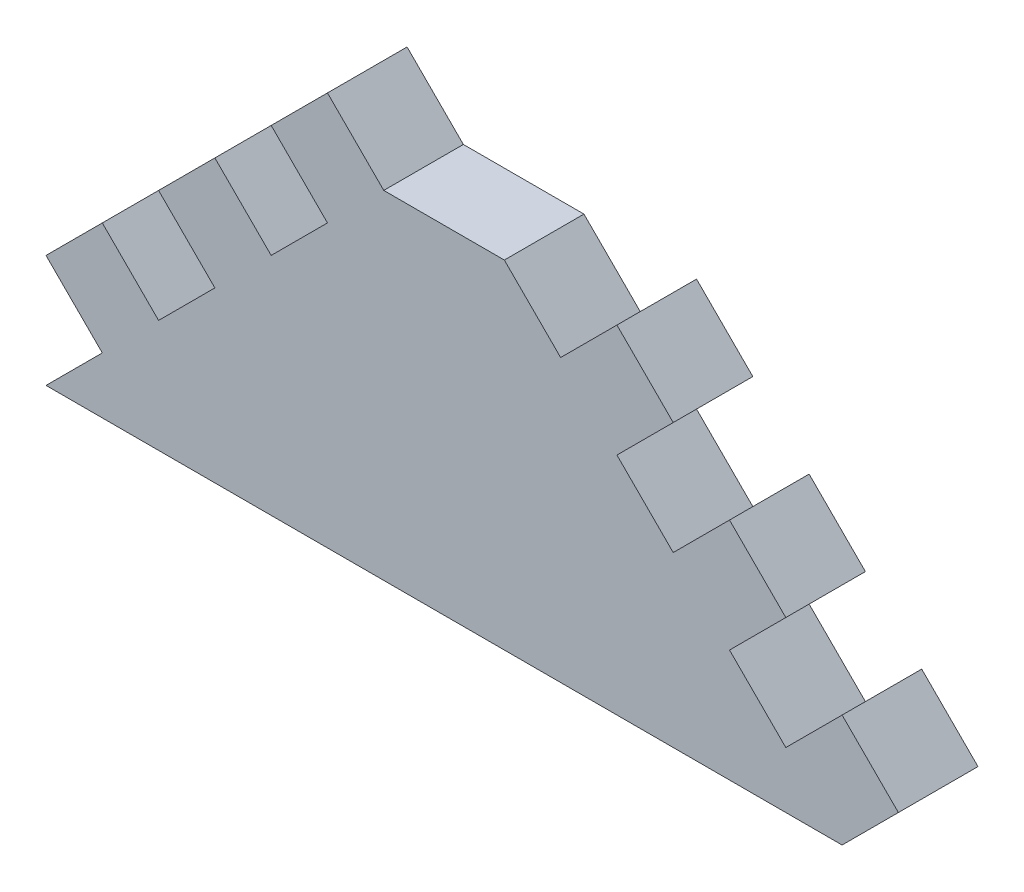
ISO-10303-21;
HEADER;
FILE_DESCRIPTION(('STEP AP214'),'2;1');
FILE_NAME('part.step','',(''),(''),'','','');
FILE_SCHEMA(('AUTOMOTIVE_DESIGN { 1 0 10303 214 1 1 1 1 }'));
ENDSEC;
DATA;
#1=APPLICATION_CONTEXT('core data for automotive mechanical design processes');
#2=APPLICATION_PROTOCOL_DEFINITION('international standard','automotive_design',2000,#1);
#3=PRODUCT_CONTEXT('',#1,'mechanical');
#4=PRODUCT('Part','Part','',(#3));
#5=PRODUCT_RELATED_PRODUCT_CATEGORY('part','',(#4));
#6=PRODUCT_DEFINITION_FORMATION('','',#4);
#7=PRODUCT_DEFINITION_CONTEXT('part definition',#1,'design');
#8=PRODUCT_DEFINITION('design','',#6,#7);
#9=PRODUCT_DEFINITION_SHAPE('','',#8);
#10=(LENGTH_UNIT() NAMED_UNIT(*) SI_UNIT(.MILLI.,.METRE.));
#11=(NAMED_UNIT(*) PLANE_ANGLE_UNIT() SI_UNIT($,.RADIAN.));
#12=(NAMED_UNIT(*) SI_UNIT($,.STERADIAN.) SOLID_ANGLE_UNIT());
#13=UNCERTAINTY_MEASURE_WITH_UNIT(LENGTH_MEASURE(1.E-05),#10,'distance_accuracy_value','');
#14=(GEOMETRIC_REPRESENTATION_CONTEXT(3) GLOBAL_UNCERTAINTY_ASSIGNED_CONTEXT((#13)) GLOBAL_UNIT_ASSIGNED_CONTEXT((#10,
#11,#12)) REPRESENTATION_CONTEXT('',''));
#15=CARTESIAN_POINT('',(0.,0.,0.));
#16=DIRECTION('',(0.,0.,1.));
#17=DIRECTION('',(1.,0.,0.));
#18=AXIS2_PLACEMENT_3D('',#15,#16,#17);
#19=CARTESIAN_POINT('',(0.,0.,5.));
#20=DIRECTION('',(0.707106781186545,-0.70710678118655,0.));
#21=DIRECTION('',(0.70710678118655,0.707106781186545,0.));
#22=AXIS2_PLACEMENT_3D('',#19,#20,#21);
#23=PLANE('',#22);
#24=DIRECTION('',(-0.70710678118655,-0.707106781186545,0.));
#25=VECTOR('',#24,1.);
#26=CARTESIAN_POINT('',(0.,0.,0.));
#27=LINE('',#26,#25);
#28=CARTESIAN_POINT('',(3.53553390593276,3.53553390593273,0.));
#29=VERTEX_POINT('',#28);
#30=CARTESIAN_POINT('',(0.,0.,0.));
#31=VERTEX_POINT('',#30);
#32=EDGE_CURVE('E241',#29,#31,#27,.T.);
#33=ORIENTED_EDGE('',*,*,#32,.T.);
#34=DIRECTION('',(0.,0.,-1.));
#35=VECTOR('',#34,1.);
#36=CARTESIAN_POINT('',(0.,0.,5.));
#37=LINE('',#36,#35);
#38=CARTESIAN_POINT('',(0.,0.,5.));
#39=VERTEX_POINT('',#38);
#40=EDGE_CURVE('E11',#39,#31,#37,.T.);
#41=ORIENTED_EDGE('',*,*,#40,.F.);
#42=DIRECTION('',(-0.70710678118655,-0.707106781186545,0.));
#43=VECTOR('',#42,1.);
#44=CARTESIAN_POINT('',(0.,0.,5.));
#45=LINE('',#44,#43);
#46=CARTESIAN_POINT('',(3.53553390593276,3.53553390593273,5.));
#47=VERTEX_POINT('',#46);
#48=EDGE_CURVE('E291',#47,#39,#45,.T.);
#49=ORIENTED_EDGE('',*,*,#48,.F.);
#50=DIRECTION('',(0.,0.,-1.));
#51=VECTOR('',#50,1.);
#52=CARTESIAN_POINT('',(3.53553390593276,3.53553390593273,5.));
#53=LINE('',#52,#51);
#54=EDGE_CURVE('E237',#47,#29,#53,.T.);
#55=ORIENTED_EDGE('',*,*,#54,.T.);
#56=EDGE_LOOP('',(#33,#41,#49,#55));
#57=FACE_BOUND('',#56,.T.);
#58=ADVANCED_FACE('F37',(#57),#23,.F.);
#59=CARTESIAN_POINT('',(0.,0.,5.));
#60=DIRECTION('',(0.,1.,0.));
#61=DIRECTION('',(0.,0.,1.));
#62=AXIS2_PLACEMENT_3D('',#59,#60,#61);
#63=PLANE('',#62);
#64=DIRECTION('',(1.,0.,0.));
#65=VECTOR('',#64,1.);
#66=CARTESIAN_POINT('',(0.,0.,0.));
#67=LINE('',#66,#65);
#68=CARTESIAN_POINT('',(50.,0.,0.));
#69=VERTEX_POINT('',#68);
#70=EDGE_CURVE('E244',#31,#69,#67,.T.);
#71=ORIENTED_EDGE('',*,*,#70,.T.);
#72=DIRECTION('',(0.,0.,-1.));
#73=VECTOR('',#72,1.);
#74=CARTESIAN_POINT('',(50.,0.,5.));
#75=LINE('',#74,#73);
#76=CARTESIAN_POINT('',(50.,0.,5.));
#77=VERTEX_POINT('',#76);
#78=EDGE_CURVE('E45',#77,#69,#75,.T.);
#79=ORIENTED_EDGE('',*,*,#78,.F.);
#80=DIRECTION('',(1.,0.,0.));
#81=VECTOR('',#80,1.);
#82=CARTESIAN_POINT('',(0.,0.,5.));
#83=LINE('',#82,#81);
#84=EDGE_CURVE('E150',#39,#77,#83,.T.);
#85=ORIENTED_EDGE('',*,*,#84,.F.);
#86=ORIENTED_EDGE('',*,*,#40,.T.);
#87=EDGE_LOOP('',(#71,#79,#85,#86));
#88=FACE_BOUND('',#87,.T.);
#89=ADVANCED_FACE('F439',(#88),#63,.F.);
#90=CARTESIAN_POINT('',(53.5355339059327,3.53553390593274,5.));
#91=DIRECTION('',(-0.707106781186547,0.707106781186548,0.));
#92=DIRECTION('',(-0.707106781186548,-0.707106781186547,0.));
#93=AXIS2_PLACEMENT_3D('',#90,#91,#92);
#94=PLANE('',#93);
#95=DIRECTION('',(0.707106781186548,0.707106781186547,0.));
#96=VECTOR('',#95,1.);
#97=CARTESIAN_POINT('',(53.5355339059327,3.53553390593274,0.));
#98=LINE('',#97,#96);
#99=CARTESIAN_POINT('',(53.5355339059327,3.53553390593274,0.));
#100=VERTEX_POINT('',#99);
#101=EDGE_CURVE('E246',#69,#100,#98,.T.);
#102=ORIENTED_EDGE('',*,*,#101,.T.);
#103=DIRECTION('',(0.,0.,-1.));
#104=VECTOR('',#103,1.);
#105=CARTESIAN_POINT('',(53.5355339059327,3.53553390593274,5.));
#106=LINE('',#105,#104);
#107=CARTESIAN_POINT('',(53.5355339059327,3.53553390593274,5.));
#108=VERTEX_POINT('',#107);
#109=EDGE_CURVE('E352',#108,#100,#106,.T.);
#110=ORIENTED_EDGE('',*,*,#109,.F.);
#111=DIRECTION('',(0.707106781186548,0.707106781186547,0.));
#112=VECTOR('',#111,1.);
#113=CARTESIAN_POINT('',(53.5355339059327,3.53553390593274,5.));
#114=LINE('',#113,#112);
#115=EDGE_CURVE('E360',#77,#108,#114,.T.);
#116=ORIENTED_EDGE('',*,*,#115,.F.);
#117=ORIENTED_EDGE('',*,*,#78,.T.);
#118=EDGE_LOOP('',(#102,#110,#116,#117));
#119=FACE_BOUND('',#118,.T.);
#120=ADVANCED_FACE('F358',(#119),#94,.F.);
#121=CARTESIAN_POINT('',(50.,7.07106781186548,5.));
#122=DIRECTION('',(-0.707106781186547,-0.707106781186548,0.));
#123=DIRECTION('',(0.707106781186548,-0.707106781186547,0.));
#124=AXIS2_PLACEMENT_3D('',#121,#122,#123);
#125=PLANE('',#124);
#126=DIRECTION('',(-0.707106781186548,0.707106781186547,0.));
#127=VECTOR('',#126,1.);
#128=CARTESIAN_POINT('',(50.,7.07106781186548,0.));
#129=LINE('',#128,#127);
#130=CARTESIAN_POINT('',(50.,7.07106781186548,0.));
#131=VERTEX_POINT('',#130);
#132=EDGE_CURVE('E248',#100,#131,#129,.T.);
#133=ORIENTED_EDGE('',*,*,#132,.T.);
#134=DIRECTION('',(0.,0.,-1.));
#135=VECTOR('',#134,1.);
#136=CARTESIAN_POINT('',(50.,7.07106781186548,5.));
#137=LINE('',#136,#135);
#138=CARTESIAN_POINT('',(50.,7.07106781186548,5.));
#139=VERTEX_POINT('',#138);
#140=EDGE_CURVE('E349',#139,#131,#137,.T.);
#141=ORIENTED_EDGE('',*,*,#140,.F.);
#142=DIRECTION('',(-0.707106781186548,0.707106781186547,0.));
#143=VECTOR('',#142,1.);
#144=CARTESIAN_POINT('',(50.,7.07106781186548,5.));
#145=LINE('',#144,#143);
#146=EDGE_CURVE('E378',#108,#139,#145,.T.);
#147=ORIENTED_EDGE('',*,*,#146,.F.);
#148=ORIENTED_EDGE('',*,*,#109,.T.);
#149=EDGE_LOOP('',(#133,#141,#147,#148));
#150=FACE_BOUND('',#149,.T.);
#151=ADVANCED_FACE('F369',(#150),#125,.F.);
#152=CARTESIAN_POINT('',(46.4644660940673,3.53553390593275,5.));
#153=DIRECTION('',(0.707106781186547,-0.707106781186548,0.));
#154=DIRECTION('',(0.707106781186548,0.707106781186547,0.));
#155=AXIS2_PLACEMENT_3D('',#152,#153,#154);
#156=PLANE('',#155);
#157=DIRECTION('',(-0.707106781186548,-0.707106781186547,0.));
#158=VECTOR('',#157,1.);
#159=CARTESIAN_POINT('',(46.4644660940673,3.53553390593275,0.));
#160=LINE('',#159,#158);
#161=CARTESIAN_POINT('',(46.4644660940673,3.53553390593275,0.));
#162=VERTEX_POINT('',#161);
#163=EDGE_CURVE('E250',#131,#162,#160,.T.);
#164=ORIENTED_EDGE('',*,*,#163,.T.);
#165=DIRECTION('',(0.,0.,-1.));
#166=VECTOR('',#165,1.);
#167=CARTESIAN_POINT('',(46.4644660940673,3.53553390593275,5.));
#168=LINE('',#167,#166);
#169=CARTESIAN_POINT('',(46.4644660940673,3.53553390593275,5.));
#170=VERTEX_POINT('',#169);
#171=EDGE_CURVE('E346',#170,#162,#168,.T.);
#172=ORIENTED_EDGE('',*,*,#171,.F.);
#173=DIRECTION('',(-0.707106781186548,-0.707106781186547,0.));
#174=VECTOR('',#173,1.);
#175=CARTESIAN_POINT('',(46.4644660940673,3.53553390593275,5.));
#176=LINE('',#175,#174);
#177=EDGE_CURVE('E375',#139,#170,#176,.T.);
#178=ORIENTED_EDGE('',*,*,#177,.F.);
#179=ORIENTED_EDGE('',*,*,#140,.T.);
#180=EDGE_LOOP('',(#164,#172,#178,#179));
#181=FACE_BOUND('',#180,.T.);
#182=ADVANCED_FACE('F373',(#181),#156,.F.);
#183=CARTESIAN_POINT('',(42.9289321881345,7.07106781186549,5.));
#184=DIRECTION('',(-0.707106781186549,-0.707106781186546,0.));
#185=DIRECTION('',(0.707106781186546,-0.707106781186549,0.));
#186=AXIS2_PLACEMENT_3D('',#183,#184,#185);
#187=PLANE('',#186);
#188=DIRECTION('',(-0.707106781186546,0.707106781186549,0.));
#189=VECTOR('',#188,1.);
#190=CARTESIAN_POINT('',(42.9289321881345,7.07106781186549,0.));
#191=LINE('',#190,#189);
#192=CARTESIAN_POINT('',(42.9289321881345,7.07106781186549,0.));
#193=VERTEX_POINT('',#192);
#194=EDGE_CURVE('E252',#162,#193,#191,.T.);
#195=ORIENTED_EDGE('',*,*,#194,.T.);
#196=DIRECTION('',(0.,0.,-1.));
#197=VECTOR('',#196,1.);
#198=CARTESIAN_POINT('',(42.9289321881345,7.07106781186549,5.));
#199=LINE('',#198,#197);
#200=CARTESIAN_POINT('',(42.9289321881345,7.07106781186549,5.));
#201=VERTEX_POINT('',#200);
#202=EDGE_CURVE('E343',#201,#193,#199,.T.);
#203=ORIENTED_EDGE('',*,*,#202,.F.);
#204=DIRECTION('',(-0.707106781186546,0.707106781186549,0.));
#205=VECTOR('',#204,1.);
#206=CARTESIAN_POINT('',(42.9289321881345,7.07106781186549,5.));
#207=LINE('',#206,#205);
#208=EDGE_CURVE('E377',#170,#201,#207,.T.);
#209=ORIENTED_EDGE('',*,*,#208,.F.);
#210=ORIENTED_EDGE('',*,*,#171,.T.);
#211=EDGE_LOOP('',(#195,#203,#209,#210));
#212=FACE_BOUND('',#211,.T.);
#213=ADVANCED_FACE('F452',(#212),#187,.F.);
#214=CARTESIAN_POINT('',(46.4644660940673,10.6066017177982,5.));
#215=DIRECTION('',(-0.707106781186547,0.707106781186548,0.));
#216=DIRECTION('',(-0.707106781186548,-0.707106781186547,0.));
#217=AXIS2_PLACEMENT_3D('',#214,#215,#216);
#218=PLANE('',#217);
#219=DIRECTION('',(0.707106781186548,0.707106781186547,0.));
#220=VECTOR('',#219,1.);
#221=CARTESIAN_POINT('',(46.4644660940673,10.6066017177982,0.));
#222=LINE('',#221,#220);
#223=CARTESIAN_POINT('',(46.4644660940673,10.6066017177982,0.));
#224=VERTEX_POINT('',#223);
#225=EDGE_CURVE('E254',#193,#224,#222,.T.);
#226=ORIENTED_EDGE('',*,*,#225,.T.);
#227=DIRECTION('',(0.,0.,-1.));
#228=VECTOR('',#227,1.);
#229=CARTESIAN_POINT('',(46.4644660940673,10.6066017177982,5.));
#230=LINE('',#229,#228);
#231=CARTESIAN_POINT('',(46.4644660940673,10.6066017177982,5.));
#232=VERTEX_POINT('',#231);
#233=EDGE_CURVE('E340',#232,#224,#230,.T.);
#234=ORIENTED_EDGE('',*,*,#233,.F.);
#235=DIRECTION('',(0.707106781186548,0.707106781186547,0.));
#236=VECTOR('',#235,1.);
#237=CARTESIAN_POINT('',(46.4644660940673,10.6066017177982,5.));
#238=LINE('',#237,#236);
#239=EDGE_CURVE('E380',#201,#232,#238,.T.);
#240=ORIENTED_EDGE('',*,*,#239,.F.);
#241=ORIENTED_EDGE('',*,*,#202,.T.);
#242=EDGE_LOOP('',(#226,#234,#240,#241));
#243=FACE_BOUND('',#242,.T.);
#244=ADVANCED_FACE('F455',(#243),#218,.F.);
#245=CARTESIAN_POINT('',(42.9289321881345,14.142135623731,5.));
#246=DIRECTION('',(-0.70710678118655,-0.707106781186545,0.));
#247=DIRECTION('',(0.707106781186545,-0.70710678118655,0.));
#248=AXIS2_PLACEMENT_3D('',#245,#246,#247);
#249=PLANE('',#248);
#250=DIRECTION('',(-0.707106781186545,0.70710678118655,0.));
#251=VECTOR('',#250,1.);
#252=CARTESIAN_POINT('',(42.9289321881345,14.142135623731,0.));
#253=LINE('',#252,#251);
#254=CARTESIAN_POINT('',(42.9289321881345,14.142135623731,0.));
#255=VERTEX_POINT('',#254);
#256=EDGE_CURVE('E256',#224,#255,#253,.T.);
#257=ORIENTED_EDGE('',*,*,#256,.T.);
#258=DIRECTION('',(0.,0.,-1.));
#259=VECTOR('',#258,1.);
#260=CARTESIAN_POINT('',(42.9289321881345,14.142135623731,5.));
#261=LINE('',#260,#259);
#262=CARTESIAN_POINT('',(42.9289321881345,14.142135623731,5.));
#263=VERTEX_POINT('',#262);
#264=EDGE_CURVE('E337',#263,#255,#261,.T.);
#265=ORIENTED_EDGE('',*,*,#264,.F.);
#266=DIRECTION('',(-0.707106781186545,0.70710678118655,0.));
#267=VECTOR('',#266,1.);
#268=CARTESIAN_POINT('',(42.9289321881345,14.142135623731,5.));
#269=LINE('',#268,#267);
#270=EDGE_CURVE('E386',#232,#263,#269,.T.);
#271=ORIENTED_EDGE('',*,*,#270,.F.);
#272=ORIENTED_EDGE('',*,*,#233,.T.);
#273=EDGE_LOOP('',(#257,#265,#271,#272));
#274=FACE_BOUND('',#273,.T.);
#275=ADVANCED_FACE('F459',(#274),#249,.F.);
#276=CARTESIAN_POINT('',(39.3933982822018,10.6066017177982,5.));
#277=DIRECTION('',(0.707106781186547,-0.707106781186548,0.));
#278=DIRECTION('',(0.707106781186548,0.707106781186547,0.));
#279=AXIS2_PLACEMENT_3D('',#276,#277,#278);
#280=PLANE('',#279);
#281=DIRECTION('',(-0.707106781186548,-0.707106781186547,0.));
#282=VECTOR('',#281,1.);
#283=CARTESIAN_POINT('',(39.3933982822018,10.6066017177982,0.));
#284=LINE('',#283,#282);
#285=CARTESIAN_POINT('',(39.3933982822018,10.6066017177982,0.));
#286=VERTEX_POINT('',#285);
#287=EDGE_CURVE('E258',#255,#286,#284,.T.);
#288=ORIENTED_EDGE('',*,*,#287,.T.);
#289=DIRECTION('',(0.,0.,-1.));
#290=VECTOR('',#289,1.);
#291=CARTESIAN_POINT('',(39.3933982822018,10.6066017177982,5.));
#292=LINE('',#291,#290);
#293=CARTESIAN_POINT('',(39.3933982822018,10.6066017177982,5.));
#294=VERTEX_POINT('',#293);
#295=EDGE_CURVE('E334',#294,#286,#292,.T.);
#296=ORIENTED_EDGE('',*,*,#295,.F.);
#297=DIRECTION('',(-0.707106781186548,-0.707106781186547,0.));
#298=VECTOR('',#297,1.);
#299=CARTESIAN_POINT('',(39.3933982822018,10.6066017177982,5.));
#300=LINE('',#299,#298);
#301=EDGE_CURVE('E388',#263,#294,#300,.T.);
#302=ORIENTED_EDGE('',*,*,#301,.F.);
#303=ORIENTED_EDGE('',*,*,#264,.T.);
#304=EDGE_LOOP('',(#288,#296,#302,#303));
#305=FACE_BOUND('',#304,.T.);
#306=ADVANCED_FACE('F463',(#305),#280,.F.);
#307=CARTESIAN_POINT('',(35.8578643762691,14.142135623731,5.));
#308=DIRECTION('',(-0.707106781186549,-0.707106781186546,0.));
#309=DIRECTION('',(0.707106781186546,-0.707106781186549,0.));
#310=AXIS2_PLACEMENT_3D('',#307,#308,#309);
#311=PLANE('',#310);
#312=DIRECTION('',(-0.707106781186546,0.707106781186549,0.));
#313=VECTOR('',#312,1.);
#314=CARTESIAN_POINT('',(35.8578643762691,14.142135623731,0.));
#315=LINE('',#314,#313);
#316=CARTESIAN_POINT('',(35.8578643762691,14.142135623731,0.));
#317=VERTEX_POINT('',#316);
#318=EDGE_CURVE('E260',#286,#317,#315,.T.);
#319=ORIENTED_EDGE('',*,*,#318,.T.);
#320=DIRECTION('',(0.,0.,-1.));
#321=VECTOR('',#320,1.);
#322=CARTESIAN_POINT('',(35.8578643762691,14.142135623731,5.));
#323=LINE('',#322,#321);
#324=CARTESIAN_POINT('',(35.8578643762691,14.142135623731,5.));
#325=VERTEX_POINT('',#324);
#326=EDGE_CURVE('E331',#325,#317,#323,.T.);
#327=ORIENTED_EDGE('',*,*,#326,.F.);
#328=DIRECTION('',(-0.707106781186546,0.707106781186549,0.));
#329=VECTOR('',#328,1.);
#330=CARTESIAN_POINT('',(35.8578643762691,14.142135623731,5.));
#331=LINE('',#330,#329);
#332=EDGE_CURVE('E390',#294,#325,#331,.T.);
#333=ORIENTED_EDGE('',*,*,#332,.F.);
#334=ORIENTED_EDGE('',*,*,#295,.T.);
#335=EDGE_LOOP('',(#319,#327,#333,#334));
#336=FACE_BOUND('',#335,.T.);
#337=ADVANCED_FACE('F467',(#336),#311,.F.);
#338=CARTESIAN_POINT('',(39.3933982822018,17.6776695296637,5.));
#339=DIRECTION('',(-0.707106781186546,0.707106781186549,0.));
#340=DIRECTION('',(-0.707106781186549,-0.707106781186546,0.));
#341=AXIS2_PLACEMENT_3D('',#338,#339,#340);
#342=PLANE('',#341);
#343=DIRECTION('',(0.707106781186549,0.707106781186546,0.));
#344=VECTOR('',#343,1.);
#345=CARTESIAN_POINT('',(39.3933982822018,17.6776695296637,0.));
#346=LINE('',#345,#344);
#347=CARTESIAN_POINT('',(39.3933982822018,17.6776695296637,0.));
#348=VERTEX_POINT('',#347);
#349=EDGE_CURVE('E262',#317,#348,#346,.T.);
#350=ORIENTED_EDGE('',*,*,#349,.T.);
#351=DIRECTION('',(0.,0.,-1.));
#352=VECTOR('',#351,1.);
#353=CARTESIAN_POINT('',(39.3933982822018,17.6776695296637,5.));
#354=LINE('',#353,#352);
#355=CARTESIAN_POINT('',(39.3933982822018,17.6776695296637,5.));
#356=VERTEX_POINT('',#355);
#357=EDGE_CURVE('E328',#356,#348,#354,.T.);
#358=ORIENTED_EDGE('',*,*,#357,.F.);
#359=DIRECTION('',(0.707106781186549,0.707106781186546,0.));
#360=VECTOR('',#359,1.);
#361=CARTESIAN_POINT('',(39.3933982822018,17.6776695296637,5.));
#362=LINE('',#361,#360);
#363=EDGE_CURVE('E392',#325,#356,#362,.T.);
#364=ORIENTED_EDGE('',*,*,#363,.F.);
#365=ORIENTED_EDGE('',*,*,#326,.T.);
#366=EDGE_LOOP('',(#350,#358,#364,#365));
#367=FACE_BOUND('',#366,.T.);
#368=ADVANCED_FACE('F471',(#367),#342,.F.);
#369=CARTESIAN_POINT('',(35.8578643762691,21.2132034355964,5.));
#370=DIRECTION('',(-0.707106781186547,-0.707106781186548,0.));
#371=DIRECTION('',(0.707106781186548,-0.707106781186547,0.));
#372=AXIS2_PLACEMENT_3D('',#369,#370,#371);
#373=PLANE('',#372);
#374=DIRECTION('',(-0.707106781186548,0.707106781186547,0.));
#375=VECTOR('',#374,1.);
#376=CARTESIAN_POINT('',(35.8578643762691,21.2132034355964,0.));
#377=LINE('',#376,#375);
#378=CARTESIAN_POINT('',(35.8578643762691,21.2132034355964,0.));
#379=VERTEX_POINT('',#378);
#380=EDGE_CURVE('E264',#348,#379,#377,.T.);
#381=ORIENTED_EDGE('',*,*,#380,.T.);
#382=DIRECTION('',(0.,0.,-1.));
#383=VECTOR('',#382,1.);
#384=CARTESIAN_POINT('',(35.8578643762691,21.2132034355964,5.));
#385=LINE('',#384,#383);
#386=CARTESIAN_POINT('',(35.8578643762691,21.2132034355964,5.));
#387=VERTEX_POINT('',#386);
#388=EDGE_CURVE('E325',#387,#379,#385,.T.);
#389=ORIENTED_EDGE('',*,*,#388,.F.);
#390=DIRECTION('',(-0.707106781186548,0.707106781186547,0.));
#391=VECTOR('',#390,1.);
#392=CARTESIAN_POINT('',(35.8578643762691,21.2132034355964,5.));
#393=LINE('',#392,#391);
#394=EDGE_CURVE('E394',#356,#387,#393,.T.);
#395=ORIENTED_EDGE('',*,*,#394,.F.);
#396=ORIENTED_EDGE('',*,*,#357,.T.);
#397=EDGE_LOOP('',(#381,#389,#395,#396));
#398=FACE_BOUND('',#397,.T.);
#399=ADVANCED_FACE('F475',(#398),#373,.F.);
#400=CARTESIAN_POINT('',(32.3223304703364,17.6776695296637,5.));
#401=DIRECTION('',(0.707106781186547,-0.707106781186548,0.));
#402=DIRECTION('',(0.707106781186548,0.707106781186547,0.));
#403=AXIS2_PLACEMENT_3D('',#400,#401,#402);
#404=PLANE('',#403);
#405=DIRECTION('',(-0.707106781186548,-0.707106781186547,0.));
#406=VECTOR('',#405,1.);
#407=CARTESIAN_POINT('',(32.3223304703364,17.6776695296637,0.));
#408=LINE('',#407,#406);
#409=CARTESIAN_POINT('',(32.3223304703364,17.6776695296637,0.));
#410=VERTEX_POINT('',#409);
#411=EDGE_CURVE('E266',#379,#410,#408,.T.);
#412=ORIENTED_EDGE('',*,*,#411,.T.);
#413=DIRECTION('',(0.,0.,-1.));
#414=VECTOR('',#413,1.);
#415=CARTESIAN_POINT('',(32.3223304703364,17.6776695296637,5.));
#416=LINE('',#415,#414);
#417=CARTESIAN_POINT('',(32.3223304703364,17.6776695296637,5.));
#418=VERTEX_POINT('',#417);
#419=EDGE_CURVE('E322',#418,#410,#416,.T.);
#420=ORIENTED_EDGE('',*,*,#419,.F.);
#421=DIRECTION('',(-0.707106781186548,-0.707106781186547,0.));
#422=VECTOR('',#421,1.);
#423=CARTESIAN_POINT('',(32.3223304703364,17.6776695296637,5.));
#424=LINE('',#423,#422);
#425=EDGE_CURVE('E396',#387,#418,#424,.T.);
#426=ORIENTED_EDGE('',*,*,#425,.F.);
#427=ORIENTED_EDGE('',*,*,#388,.T.);
#428=EDGE_LOOP('',(#412,#420,#426,#427));
#429=FACE_BOUND('',#428,.T.);
#430=ADVANCED_FACE('F479',(#429),#404,.F.);
#431=CARTESIAN_POINT('',(28.7867965644036,21.2132034355965,5.));
#432=DIRECTION('',(-0.707106781186549,-0.707106781186546,0.));
#433=DIRECTION('',(0.707106781186546,-0.707106781186549,0.));
#434=AXIS2_PLACEMENT_3D('',#431,#432,#433);
#435=PLANE('',#434);
#436=DIRECTION('',(-0.707106781186546,0.707106781186549,0.));
#437=VECTOR('',#436,1.);
#438=CARTESIAN_POINT('',(28.7867965644036,21.2132034355965,0.));
#439=LINE('',#438,#437);
#440=CARTESIAN_POINT('',(28.7867965644036,21.2132034355965,0.));
#441=VERTEX_POINT('',#440);
#442=EDGE_CURVE('E268',#410,#441,#439,.T.);
#443=ORIENTED_EDGE('',*,*,#442,.T.);
#444=DIRECTION('',(0.,0.,-1.));
#445=VECTOR('',#444,1.);
#446=CARTESIAN_POINT('',(28.7867965644036,21.2132034355965,5.));
#447=LINE('',#446,#445);
#448=CARTESIAN_POINT('',(28.7867965644036,21.2132034355965,5.));
#449=VERTEX_POINT('',#448);
#450=EDGE_CURVE('E319',#449,#441,#447,.T.);
#451=ORIENTED_EDGE('',*,*,#450,.F.);
#452=DIRECTION('',(-0.707106781186546,0.707106781186549,0.));
#453=VECTOR('',#452,1.);
#454=CARTESIAN_POINT('',(28.7867965644036,21.2132034355965,5.));
#455=LINE('',#454,#453);
#456=EDGE_CURVE('E398',#418,#449,#455,.T.);
#457=ORIENTED_EDGE('',*,*,#456,.F.);
#458=ORIENTED_EDGE('',*,*,#419,.T.);
#459=EDGE_LOOP('',(#443,#451,#457,#458));
#460=FACE_BOUND('',#459,.T.);
#461=ADVANCED_FACE('F483',(#460),#435,.F.);
#462=CARTESIAN_POINT('',(28.7867965644036,21.2132034355965,5.));
#463=DIRECTION('',(0.,-1.,0.));
#464=DIRECTION('',(1.,0.,0.));
#465=AXIS2_PLACEMENT_3D('',#462,#463,#464);
#466=PLANE('',#465);
#467=DIRECTION('',(-1.,0.,0.));
#468=VECTOR('',#467,1.);
#469=CARTESIAN_POINT('',(28.7867965644036,21.2132034355965,0.));
#470=LINE('',#469,#468);
#471=CARTESIAN_POINT('',(21.2132034355964,21.2132034355965,0.));
#472=VERTEX_POINT('',#471);
#473=EDGE_CURVE('E270',#441,#472,#470,.T.);
#474=ORIENTED_EDGE('',*,*,#473,.T.);
#475=DIRECTION('',(0.,0.,-1.));
#476=VECTOR('',#475,1.);
#477=CARTESIAN_POINT('',(21.2132034355964,21.2132034355965,5.));
#478=LINE('',#477,#476);
#479=CARTESIAN_POINT('',(21.2132034355964,21.2132034355965,5.));
#480=VERTEX_POINT('',#479);
#481=EDGE_CURVE('E316',#480,#472,#478,.T.);
#482=ORIENTED_EDGE('',*,*,#481,.F.);
#483=DIRECTION('',(-1.,0.,0.));
#484=VECTOR('',#483,1.);
#485=CARTESIAN_POINT('',(28.7867965644036,21.2132034355965,5.));
#486=LINE('',#485,#484);
#487=EDGE_CURVE('E400',#449,#480,#486,.T.);
#488=ORIENTED_EDGE('',*,*,#487,.F.);
#489=ORIENTED_EDGE('',*,*,#450,.T.);
#490=EDGE_LOOP('',(#474,#482,#488,#489));
#491=FACE_BOUND('',#490,.T.);
#492=ADVANCED_FACE('F487',(#491),#466,.F.);
#493=CARTESIAN_POINT('',(17.6776695296637,24.7487373415292,5.));
#494=DIRECTION('',(-0.707106781186547,-0.707106781186548,0.));
#495=DIRECTION('',(0.707106781186548,-0.707106781186547,0.));
#496=AXIS2_PLACEMENT_3D('',#493,#494,#495);
#497=PLANE('',#496);
#498=DIRECTION('',(-0.707106781186548,0.707106781186547,0.));
#499=VECTOR('',#498,1.);
#500=CARTESIAN_POINT('',(17.6776695296637,24.7487373415292,0.));
#501=LINE('',#500,#499);
#502=CARTESIAN_POINT('',(17.6776695296637,24.7487373415292,0.));
#503=VERTEX_POINT('',#502);
#504=EDGE_CURVE('E272',#472,#503,#501,.T.);
#505=ORIENTED_EDGE('',*,*,#504,.T.);
#506=DIRECTION('',(0.,0.,-1.));
#507=VECTOR('',#506,1.);
#508=CARTESIAN_POINT('',(17.6776695296637,24.7487373415292,5.));
#509=LINE('',#508,#507);
#510=CARTESIAN_POINT('',(17.6776695296637,24.7487373415292,5.));
#511=VERTEX_POINT('',#510);
#512=EDGE_CURVE('E313',#511,#503,#509,.T.);
#513=ORIENTED_EDGE('',*,*,#512,.F.);
#514=DIRECTION('',(-0.707106781186548,0.707106781186547,0.));
#515=VECTOR('',#514,1.);
#516=CARTESIAN_POINT('',(17.6776695296637,24.7487373415292,5.));
#517=LINE('',#516,#515);
#518=EDGE_CURVE('E402',#480,#511,#517,.T.);
#519=ORIENTED_EDGE('',*,*,#518,.F.);
#520=ORIENTED_EDGE('',*,*,#481,.T.);
#521=EDGE_LOOP('',(#505,#513,#519,#520));
#522=FACE_BOUND('',#521,.T.);
#523=ADVANCED_FACE('F491',(#522),#497,.F.);
#524=CARTESIAN_POINT('',(14.1421356237309,21.2132034355964,5.));
#525=DIRECTION('',(0.707106781186549,-0.707106781186546,0.));
#526=DIRECTION('',(0.707106781186546,0.707106781186549,0.));
#527=AXIS2_PLACEMENT_3D('',#524,#525,#526);
#528=PLANE('',#527);
#529=DIRECTION('',(-0.707106781186546,-0.707106781186549,0.));
#530=VECTOR('',#529,1.);
#531=CARTESIAN_POINT('',(14.1421356237309,21.2132034355964,0.));
#532=LINE('',#531,#530);
#533=CARTESIAN_POINT('',(14.1421356237309,21.2132034355964,0.));
#534=VERTEX_POINT('',#533);
#535=EDGE_CURVE('E274',#503,#534,#532,.T.);
#536=ORIENTED_EDGE('',*,*,#535,.T.);
#537=DIRECTION('',(0.,0.,-1.));
#538=VECTOR('',#537,1.);
#539=CARTESIAN_POINT('',(14.1421356237309,21.2132034355964,5.));
#540=LINE('',#539,#538);
#541=CARTESIAN_POINT('',(14.1421356237309,21.2132034355964,5.));
#542=VERTEX_POINT('',#541);
#543=EDGE_CURVE('E310',#542,#534,#540,.T.);
#544=ORIENTED_EDGE('',*,*,#543,.F.);
#545=DIRECTION('',(-0.707106781186546,-0.707106781186549,0.));
#546=VECTOR('',#545,1.);
#547=CARTESIAN_POINT('',(14.1421356237309,21.2132034355964,5.));
#548=LINE('',#547,#546);
#549=EDGE_CURVE('E404',#511,#542,#548,.T.);
#550=ORIENTED_EDGE('',*,*,#549,.F.);
#551=ORIENTED_EDGE('',*,*,#512,.T.);
#552=EDGE_LOOP('',(#536,#544,#550,#551));
#553=FACE_BOUND('',#552,.T.);
#554=ADVANCED_FACE('F495',(#553),#528,.F.);
#555=CARTESIAN_POINT('',(17.6776695296637,17.6776695296637,5.));
#556=DIRECTION('',(0.707106781186546,0.70710678118655,0.));
#557=DIRECTION('',(-0.70710678118655,0.707106781186546,0.));
#558=AXIS2_PLACEMENT_3D('',#555,#556,#557);
#559=PLANE('',#558);
#560=DIRECTION('',(0.70710678118655,-0.707106781186546,0.));
#561=VECTOR('',#560,1.);
#562=CARTESIAN_POINT('',(17.6776695296637,17.6776695296637,0.));
#563=LINE('',#562,#561);
#564=CARTESIAN_POINT('',(17.6776695296637,17.6776695296637,0.));
#565=VERTEX_POINT('',#564);
#566=EDGE_CURVE('E276',#534,#565,#563,.T.);
#567=ORIENTED_EDGE('',*,*,#566,.T.);
#568=DIRECTION('',(0.,0.,-1.));
#569=VECTOR('',#568,1.);
#570=CARTESIAN_POINT('',(17.6776695296637,17.6776695296637,5.));
#571=LINE('',#570,#569);
#572=CARTESIAN_POINT('',(17.6776695296637,17.6776695296637,5.));
#573=VERTEX_POINT('',#572);
#574=EDGE_CURVE('E307',#573,#565,#571,.T.);
#575=ORIENTED_EDGE('',*,*,#574,.F.);
#576=DIRECTION('',(0.70710678118655,-0.707106781186546,0.));
#577=VECTOR('',#576,1.);
#578=CARTESIAN_POINT('',(17.6776695296637,17.6776695296637,5.));
#579=LINE('',#578,#577);
#580=EDGE_CURVE('E406',#542,#573,#579,.T.);
#581=ORIENTED_EDGE('',*,*,#580,.F.);
#582=ORIENTED_EDGE('',*,*,#543,.T.);
#583=EDGE_LOOP('',(#567,#575,#581,#582));
#584=FACE_BOUND('',#583,.T.);
#585=ADVANCED_FACE('F499',(#584),#559,.F.);
#586=CARTESIAN_POINT('',(14.1421356237309,14.142135623731,5.));
#587=DIRECTION('',(0.707106781186549,-0.707106781186546,0.));
#588=DIRECTION('',(0.707106781186546,0.707106781186549,0.));
#589=AXIS2_PLACEMENT_3D('',#586,#587,#588);
#590=PLANE('',#589);
#591=DIRECTION('',(-0.707106781186546,-0.707106781186549,0.));
#592=VECTOR('',#591,1.);
#593=CARTESIAN_POINT('',(14.1421356237309,14.142135623731,0.));
#594=LINE('',#593,#592);
#595=CARTESIAN_POINT('',(14.1421356237309,14.142135623731,0.));
#596=VERTEX_POINT('',#595);
#597=EDGE_CURVE('E278',#565,#596,#594,.T.);
#598=ORIENTED_EDGE('',*,*,#597,.T.);
#599=DIRECTION('',(0.,0.,-1.));
#600=VECTOR('',#599,1.);
#601=CARTESIAN_POINT('',(14.1421356237309,14.142135623731,5.));
#602=LINE('',#601,#600);
#603=CARTESIAN_POINT('',(14.1421356237309,14.142135623731,5.));
#604=VERTEX_POINT('',#603);
#605=EDGE_CURVE('E304',#604,#596,#602,.T.);
#606=ORIENTED_EDGE('',*,*,#605,.F.);
#607=DIRECTION('',(-0.707106781186546,-0.707106781186549,0.));
#608=VECTOR('',#607,1.);
#609=CARTESIAN_POINT('',(14.1421356237309,14.142135623731,5.));
#610=LINE('',#609,#608);
#611=EDGE_CURVE('E408',#573,#604,#610,.T.);
#612=ORIENTED_EDGE('',*,*,#611,.F.);
#613=ORIENTED_EDGE('',*,*,#574,.T.);
#614=EDGE_LOOP('',(#598,#606,#612,#613));
#615=FACE_BOUND('',#614,.T.);
#616=ADVANCED_FACE('F503',(#615),#590,.F.);
#617=CARTESIAN_POINT('',(10.6066017177982,17.6776695296637,5.));
#618=DIRECTION('',(-0.707106781186546,-0.707106781186549,0.));
#619=DIRECTION('',(0.707106781186549,-0.707106781186546,0.));
#620=AXIS2_PLACEMENT_3D('',#617,#618,#619);
#621=PLANE('',#620);
#622=DIRECTION('',(-0.707106781186549,0.707106781186546,0.));
#623=VECTOR('',#622,1.);
#624=CARTESIAN_POINT('',(10.6066017177982,17.6776695296637,0.));
#625=LINE('',#624,#623);
#626=CARTESIAN_POINT('',(10.6066017177982,17.6776695296637,0.));
#627=VERTEX_POINT('',#626);
#628=EDGE_CURVE('E280',#596,#627,#625,.T.);
#629=ORIENTED_EDGE('',*,*,#628,.T.);
#630=DIRECTION('',(0.,0.,-1.));
#631=VECTOR('',#630,1.);
#632=CARTESIAN_POINT('',(10.6066017177982,17.6776695296637,5.));
#633=LINE('',#632,#631);
#634=CARTESIAN_POINT('',(10.6066017177982,17.6776695296637,5.));
#635=VERTEX_POINT('',#634);
#636=EDGE_CURVE('E301',#635,#627,#633,.T.);
#637=ORIENTED_EDGE('',*,*,#636,.F.);
#638=DIRECTION('',(-0.707106781186549,0.707106781186546,0.));
#639=VECTOR('',#638,1.);
#640=CARTESIAN_POINT('',(10.6066017177982,17.6776695296637,5.));
#641=LINE('',#640,#639);
#642=EDGE_CURVE('E410',#604,#635,#641,.T.);
#643=ORIENTED_EDGE('',*,*,#642,.F.);
#644=ORIENTED_EDGE('',*,*,#605,.T.);
#645=EDGE_LOOP('',(#629,#637,#643,#644));
#646=FACE_BOUND('',#645,.T.);
#647=ADVANCED_FACE('F507',(#646),#621,.F.);
#648=CARTESIAN_POINT('',(7.07106781186547,14.142135623731,5.));
#649=DIRECTION('',(0.707106781186549,-0.707106781186546,0.));
#650=DIRECTION('',(0.707106781186546,0.707106781186549,0.));
#651=AXIS2_PLACEMENT_3D('',#648,#649,#650);
#652=PLANE('',#651);
#653=DIRECTION('',(-0.707106781186546,-0.707106781186549,0.));
#654=VECTOR('',#653,1.);
#655=CARTESIAN_POINT('',(7.07106781186547,14.142135623731,0.));
#656=LINE('',#655,#654);
#657=CARTESIAN_POINT('',(7.07106781186547,14.142135623731,0.));
#658=VERTEX_POINT('',#657);
#659=EDGE_CURVE('E282',#627,#658,#656,.T.);
#660=ORIENTED_EDGE('',*,*,#659,.T.);
#661=DIRECTION('',(0.,0.,-1.));
#662=VECTOR('',#661,1.);
#663=CARTESIAN_POINT('',(7.07106781186547,14.142135623731,5.));
#664=LINE('',#663,#662);
#665=CARTESIAN_POINT('',(7.07106781186547,14.142135623731,5.));
#666=VERTEX_POINT('',#665);
#667=EDGE_CURVE('E298',#666,#658,#664,.T.);
#668=ORIENTED_EDGE('',*,*,#667,.F.);
#669=DIRECTION('',(-0.707106781186546,-0.707106781186549,0.));
#670=VECTOR('',#669,1.);
#671=CARTESIAN_POINT('',(7.07106781186547,14.142135623731,5.));
#672=LINE('',#671,#670);
#673=EDGE_CURVE('E412',#635,#666,#672,.T.);
#674=ORIENTED_EDGE('',*,*,#673,.F.);
#675=ORIENTED_EDGE('',*,*,#636,.T.);
#676=EDGE_LOOP('',(#660,#668,#674,#675));
#677=FACE_BOUND('',#676,.T.);
#678=ADVANCED_FACE('F511',(#677),#652,.F.);
#679=CARTESIAN_POINT('',(10.6066017177982,10.6066017177982,5.));
#680=DIRECTION('',(0.707106781186546,0.707106781186549,0.));
#681=DIRECTION('',(-0.707106781186549,0.707106781186546,0.));
#682=AXIS2_PLACEMENT_3D('',#679,#680,#681);
#683=PLANE('',#682);
#684=DIRECTION('',(0.707106781186549,-0.707106781186546,0.));
#685=VECTOR('',#684,1.);
#686=CARTESIAN_POINT('',(10.6066017177982,10.6066017177982,0.));
#687=LINE('',#686,#685);
#688=CARTESIAN_POINT('',(10.6066017177982,10.6066017177982,0.));
#689=VERTEX_POINT('',#688);
#690=EDGE_CURVE('E284',#658,#689,#687,.T.);
#691=ORIENTED_EDGE('',*,*,#690,.T.);
#692=DIRECTION('',(0.,0.,-1.));
#693=VECTOR('',#692,1.);
#694=CARTESIAN_POINT('',(10.6066017177982,10.6066017177982,5.));
#695=LINE('',#694,#693);
#696=CARTESIAN_POINT('',(10.6066017177982,10.6066017177982,5.));
#697=VERTEX_POINT('',#696);
#698=EDGE_CURVE('E295',#697,#689,#695,.T.);
#699=ORIENTED_EDGE('',*,*,#698,.F.);
#700=DIRECTION('',(0.707106781186549,-0.707106781186546,0.));
#701=VECTOR('',#700,1.);
#702=CARTESIAN_POINT('',(10.6066017177982,10.6066017177982,5.));
#703=LINE('',#702,#701);
#704=EDGE_CURVE('E414',#666,#697,#703,.T.);
#705=ORIENTED_EDGE('',*,*,#704,.F.);
#706=ORIENTED_EDGE('',*,*,#667,.T.);
#707=EDGE_LOOP('',(#691,#699,#705,#706));
#708=FACE_BOUND('',#707,.T.);
#709=ADVANCED_FACE('F420',(#708),#683,.F.);
#710=CARTESIAN_POINT('',(7.07106781186549,7.07106781186548,5.));
#711=DIRECTION('',(0.707106781186549,-0.707106781186546,0.));
#712=DIRECTION('',(0.707106781186546,0.707106781186549,0.));
#713=AXIS2_PLACEMENT_3D('',#710,#711,#712);
#714=PLANE('',#713);
#715=DIRECTION('',(-0.707106781186546,-0.707106781186549,0.));
#716=VECTOR('',#715,1.);
#717=CARTESIAN_POINT('',(7.07106781186549,7.07106781186548,0.));
#718=LINE('',#717,#716);
#719=CARTESIAN_POINT('',(7.07106781186549,7.07106781186548,0.));
#720=VERTEX_POINT('',#719);
#721=EDGE_CURVE('E286',#689,#720,#718,.T.);
#722=ORIENTED_EDGE('',*,*,#721,.T.);
#723=DIRECTION('',(0.,0.,-1.));
#724=VECTOR('',#723,1.);
#725=CARTESIAN_POINT('',(7.07106781186549,7.07106781186548,5.));
#726=LINE('',#725,#724);
#727=CARTESIAN_POINT('',(7.07106781186549,7.07106781186548,5.));
#728=VERTEX_POINT('',#727);
#729=EDGE_CURVE('E232',#728,#720,#726,.T.);
#730=ORIENTED_EDGE('',*,*,#729,.F.);
#731=DIRECTION('',(-0.707106781186546,-0.707106781186549,0.));
#732=VECTOR('',#731,1.);
#733=CARTESIAN_POINT('',(7.07106781186549,7.07106781186548,5.));
#734=LINE('',#733,#732);
#735=EDGE_CURVE('E223',#697,#728,#734,.T.);
#736=ORIENTED_EDGE('',*,*,#735,.F.);
#737=ORIENTED_EDGE('',*,*,#698,.T.);
#738=EDGE_LOOP('',(#722,#730,#736,#737));
#739=FACE_BOUND('',#738,.T.);
#740=ADVANCED_FACE('F424',(#739),#714,.F.);
#741=CARTESIAN_POINT('',(3.53553390593274,10.6066017177982,5.));
#742=DIRECTION('',(-0.707106781186546,-0.707106781186549,0.));
#743=DIRECTION('',(0.707106781186549,-0.707106781186546,0.));
#744=AXIS2_PLACEMENT_3D('',#741,#742,#743);
#745=PLANE('',#744);
#746=DIRECTION('',(-0.707106781186549,0.707106781186546,0.));
#747=VECTOR('',#746,1.);
#748=CARTESIAN_POINT('',(3.53553390593274,10.6066017177982,0.));
#749=LINE('',#748,#747);
#750=CARTESIAN_POINT('',(3.53553390593274,10.6066017177982,0.));
#751=VERTEX_POINT('',#750);
#752=EDGE_CURVE('E231',#720,#751,#749,.T.);
#753=ORIENTED_EDGE('',*,*,#752,.T.);
#754=DIRECTION('',(0.,0.,-1.));
#755=VECTOR('',#754,1.);
#756=CARTESIAN_POINT('',(3.53553390593274,10.6066017177982,5.));
#757=LINE('',#756,#755);
#758=CARTESIAN_POINT('',(3.53553390593274,10.6066017177982,5.));
#759=VERTEX_POINT('',#758);
#760=EDGE_CURVE('E228',#759,#751,#757,.T.);
#761=ORIENTED_EDGE('',*,*,#760,.F.);
#762=DIRECTION('',(-0.707106781186549,0.707106781186546,0.));
#763=VECTOR('',#762,1.);
#764=CARTESIAN_POINT('',(3.53553390593274,10.6066017177982,5.));
#765=LINE('',#764,#763);
#766=EDGE_CURVE('E217',#728,#759,#765,.T.);
#767=ORIENTED_EDGE('',*,*,#766,.F.);
#768=ORIENTED_EDGE('',*,*,#729,.T.);
#769=EDGE_LOOP('',(#753,#761,#767,#768));
#770=FACE_BOUND('',#769,.T.);
#771=ADVANCED_FACE('F229',(#770),#745,.F.);
#772=CARTESIAN_POINT('',(0.,7.07106781186546,5.));
#773=DIRECTION('',(0.707106781186549,-0.707106781186546,0.));
#774=DIRECTION('',(0.707106781186546,0.707106781186549,0.));
#775=AXIS2_PLACEMENT_3D('',#772,#773,#774);
#776=PLANE('',#775);
#777=DIRECTION('',(-0.707106781186546,-0.707106781186549,0.));
#778=VECTOR('',#777,1.);
#779=CARTESIAN_POINT('',(0.,7.07106781186546,0.));
#780=LINE('',#779,#778);
#781=CARTESIAN_POINT('',(0.,7.07106781186546,0.));
#782=VERTEX_POINT('',#781);
#783=EDGE_CURVE('E136',#751,#782,#780,.T.);
#784=ORIENTED_EDGE('',*,*,#783,.T.);
#785=DIRECTION('',(0.,0.,-1.));
#786=VECTOR('',#785,1.);
#787=CARTESIAN_POINT('',(0.,7.07106781186546,5.));
#788=LINE('',#787,#786);
#789=CARTESIAN_POINT('',(0.,7.07106781186546,5.));
#790=VERTEX_POINT('',#789);
#791=EDGE_CURVE('E233',#790,#782,#788,.T.);
#792=ORIENTED_EDGE('',*,*,#791,.F.);
#793=DIRECTION('',(-0.707106781186546,-0.707106781186549,0.));
#794=VECTOR('',#793,1.);
#795=CARTESIAN_POINT('',(0.,7.07106781186546,5.));
#796=LINE('',#795,#794);
#797=EDGE_CURVE('E221',#759,#790,#796,.T.);
#798=ORIENTED_EDGE('',*,*,#797,.F.);
#799=ORIENTED_EDGE('',*,*,#760,.T.);
#800=EDGE_LOOP('',(#784,#792,#798,#799));
#801=FACE_BOUND('',#800,.T.);
#802=ADVANCED_FACE('F235',(#801),#776,.F.);
#803=CARTESIAN_POINT('',(3.53553390593276,3.53553390593273,5.));
#804=DIRECTION('',(0.707106781186546,0.707106781186549,0.));
#805=DIRECTION('',(-0.707106781186549,0.707106781186546,0.));
#806=AXIS2_PLACEMENT_3D('',#803,#804,#805);
#807=PLANE('',#806);
#808=DIRECTION('',(0.707106781186549,-0.707106781186546,0.));
#809=VECTOR('',#808,1.);
#810=CARTESIAN_POINT('',(3.53553390593276,3.53553390593273,0.));
#811=LINE('',#810,#809);
#812=EDGE_CURVE('E142',#782,#29,#811,.T.);
#813=ORIENTED_EDGE('',*,*,#812,.T.);
#814=ORIENTED_EDGE('',*,*,#54,.F.);
#815=DIRECTION('',(0.707106781186549,-0.707106781186546,0.));
#816=VECTOR('',#815,1.);
#817=CARTESIAN_POINT('',(3.53553390593276,3.53553390593273,5.));
#818=LINE('',#817,#816);
#819=EDGE_CURVE('E53',#790,#47,#818,.T.);
#820=ORIENTED_EDGE('',*,*,#819,.F.);
#821=ORIENTED_EDGE('',*,*,#791,.T.);
#822=EDGE_LOOP('',(#813,#814,#820,#821));
#823=FACE_BOUND('',#822,.T.);
#824=ADVANCED_FACE('F428',(#823),#807,.F.);
#825=CARTESIAN_POINT('',(0.,0.,5.));
#826=DIRECTION('',(0.,0.,1.));
#827=DIRECTION('',(1.,0.,0.));
#828=AXIS2_PLACEMENT_3D('',#825,#826,#827);
#829=PLANE('',#828);
#830=ORIENTED_EDGE('',*,*,#48,.T.);
#831=ORIENTED_EDGE('',*,*,#84,.T.);
#832=ORIENTED_EDGE('',*,*,#115,.T.);
#833=ORIENTED_EDGE('',*,*,#146,.T.);
#834=ORIENTED_EDGE('',*,*,#177,.T.);
#835=ORIENTED_EDGE('',*,*,#208,.T.);
#836=ORIENTED_EDGE('',*,*,#239,.T.);
#837=ORIENTED_EDGE('',*,*,#270,.T.);
#838=ORIENTED_EDGE('',*,*,#301,.T.);
#839=ORIENTED_EDGE('',*,*,#332,.T.);
#840=ORIENTED_EDGE('',*,*,#363,.T.);
#841=ORIENTED_EDGE('',*,*,#394,.T.);
#842=ORIENTED_EDGE('',*,*,#425,.T.);
#843=ORIENTED_EDGE('',*,*,#456,.T.);
#844=ORIENTED_EDGE('',*,*,#487,.T.);
#845=ORIENTED_EDGE('',*,*,#518,.T.);
#846=ORIENTED_EDGE('',*,*,#549,.T.);
#847=ORIENTED_EDGE('',*,*,#580,.T.);
#848=ORIENTED_EDGE('',*,*,#611,.T.);
#849=ORIENTED_EDGE('',*,*,#642,.T.);
#850=ORIENTED_EDGE('',*,*,#673,.T.);
#851=ORIENTED_EDGE('',*,*,#704,.T.);
#852=ORIENTED_EDGE('',*,*,#735,.T.);
#853=ORIENTED_EDGE('',*,*,#766,.T.);
#854=ORIENTED_EDGE('',*,*,#797,.T.);
#855=ORIENTED_EDGE('',*,*,#819,.T.);
#856=EDGE_LOOP('',(#830,#831,#832,#833,#834,#835,#836,#837,#838,#839,#840,#841,#842,#843,#844,
#845,#846,#847,#848,#849,#850,#851,#852,#853,#854,#855));
#857=FACE_BOUND('',#856,.T.);
#858=ADVANCED_FACE('F219',(#857),#829,.T.);
#859=CARTESIAN_POINT('',(0.,0.,0.));
#860=DIRECTION('',(0.,0.,1.));
#861=DIRECTION('',(1.,0.,0.));
#862=AXIS2_PLACEMENT_3D('',#859,#860,#861);
#863=PLANE('',#862);
#864=ORIENTED_EDGE('',*,*,#32,.F.);
#865=ORIENTED_EDGE('',*,*,#812,.F.);
#866=ORIENTED_EDGE('',*,*,#783,.F.);
#867=ORIENTED_EDGE('',*,*,#752,.F.);
#868=ORIENTED_EDGE('',*,*,#721,.F.);
#869=ORIENTED_EDGE('',*,*,#690,.F.);
#870=ORIENTED_EDGE('',*,*,#659,.F.);
#871=ORIENTED_EDGE('',*,*,#628,.F.);
#872=ORIENTED_EDGE('',*,*,#597,.F.);
#873=ORIENTED_EDGE('',*,*,#566,.F.);
#874=ORIENTED_EDGE('',*,*,#535,.F.);
#875=ORIENTED_EDGE('',*,*,#504,.F.);
#876=ORIENTED_EDGE('',*,*,#473,.F.);
#877=ORIENTED_EDGE('',*,*,#442,.F.);
#878=ORIENTED_EDGE('',*,*,#411,.F.);
#879=ORIENTED_EDGE('',*,*,#380,.F.);
#880=ORIENTED_EDGE('',*,*,#349,.F.);
#881=ORIENTED_EDGE('',*,*,#318,.F.);
#882=ORIENTED_EDGE('',*,*,#287,.F.);
#883=ORIENTED_EDGE('',*,*,#256,.F.);
#884=ORIENTED_EDGE('',*,*,#225,.F.);
#885=ORIENTED_EDGE('',*,*,#194,.F.);
#886=ORIENTED_EDGE('',*,*,#163,.F.);
#887=ORIENTED_EDGE('',*,*,#132,.F.);
#888=ORIENTED_EDGE('',*,*,#101,.F.);
#889=ORIENTED_EDGE('',*,*,#70,.F.);
#890=EDGE_LOOP('',(#864,#865,#866,#867,#868,#869,#870,#871,#872,#873,#874,#875,#876,#877,#878,
#879,#880,#881,#882,#883,#884,#885,#886,#887,#888,#889));
#891=FACE_BOUND('',#890,.T.);
#892=ADVANCED_FACE('F364',(#891),#863,.F.);
#893=CLOSED_SHELL('',(#58,#89,#120,#151,#182,#213,#244,#275,#306,#337,#368,#399,#430,#461,#492,
#523,#554,#585,#616,#647,#678,#709,#740,#771,#802,#824,#858,#892));
#894=MANIFOLD_SOLID_BREP('B2',#893);
#895=ADVANCED_BREP_SHAPE_REPRESENTATION('',(#18,#894),#14);
#896=SHAPE_DEFINITION_REPRESENTATION(#9,#895);
ENDSEC;
END-ISO-10303-21;
